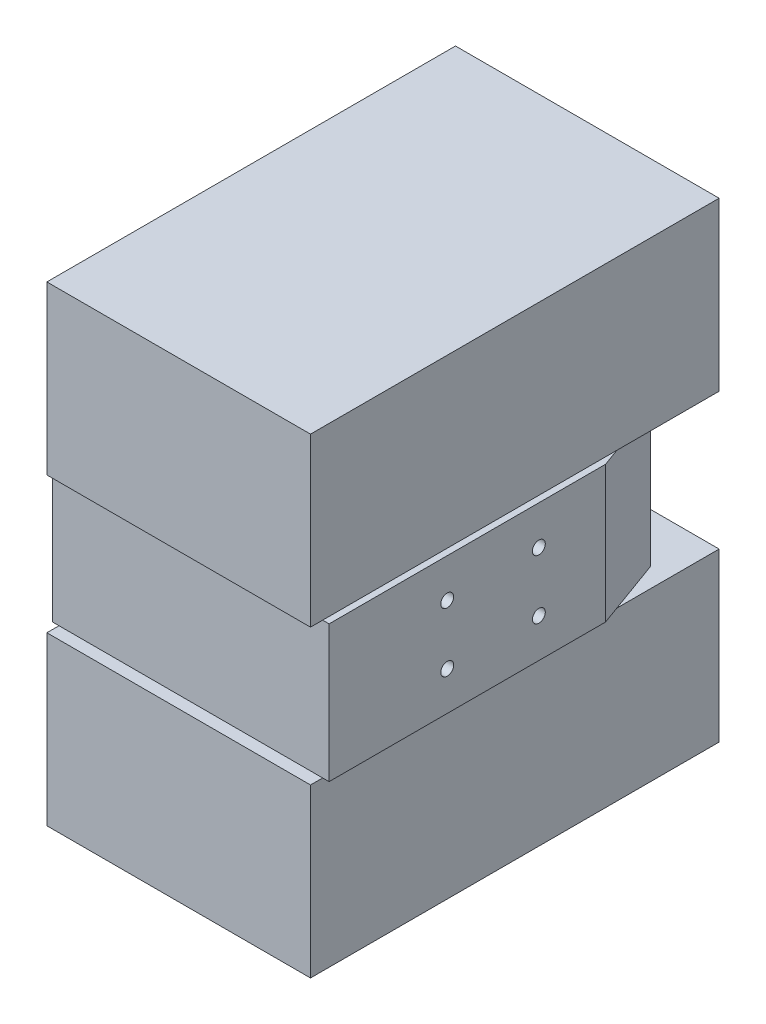
ISO-10303-21;
HEADER;
FILE_DESCRIPTION(('STEP AP214'),'2;1');
FILE_NAME('part.step','',(''),(''),'','','');
FILE_SCHEMA(('AUTOMOTIVE_DESIGN { 1 0 10303 214 1 1 1 1 }'));
ENDSEC;
DATA;
#1=APPLICATION_CONTEXT('core data for automotive mechanical design processes');
#2=APPLICATION_PROTOCOL_DEFINITION('international standard','automotive_design',2000,#1);
#3=PRODUCT_CONTEXT('',#1,'mechanical');
#4=PRODUCT('Part','Part','',(#3));
#5=PRODUCT_RELATED_PRODUCT_CATEGORY('part','',(#4));
#6=PRODUCT_DEFINITION_FORMATION('','',#4);
#7=PRODUCT_DEFINITION_CONTEXT('part definition',#1,'design');
#8=PRODUCT_DEFINITION('design','',#6,#7);
#9=PRODUCT_DEFINITION_SHAPE('','',#8);
#10=(LENGTH_UNIT() NAMED_UNIT(*) SI_UNIT(.MILLI.,.METRE.));
#11=(NAMED_UNIT(*) PLANE_ANGLE_UNIT() SI_UNIT($,.RADIAN.));
#12=(NAMED_UNIT(*) SI_UNIT($,.STERADIAN.) SOLID_ANGLE_UNIT());
#13=UNCERTAINTY_MEASURE_WITH_UNIT(LENGTH_MEASURE(1.E-05),#10,'distance_accuracy_value','');
#14=(GEOMETRIC_REPRESENTATION_CONTEXT(3) GLOBAL_UNCERTAINTY_ASSIGNED_CONTEXT((#13)) GLOBAL_UNIT_ASSIGNED_CONTEXT((#10,
#11,#12)) REPRESENTATION_CONTEXT('',''));
#15=CARTESIAN_POINT('',(0.,0.,0.));
#16=DIRECTION('',(0.,0.,1.));
#17=DIRECTION('',(1.,0.,0.));
#18=AXIS2_PLACEMENT_3D('',#15,#16,#17);
#19=CARTESIAN_POINT('',(0.,-21.25,0.));
#20=DIRECTION('',(0.,-1.,0.));
#21=DIRECTION('',(0.,0.,-1.));
#22=AXIS2_PLACEMENT_3D('',#19,#20,#21);
#23=PLANE('',#22);
#24=DIRECTION('',(-0.341743063086704,0.,0.939793423488437));
#25=VECTOR('',#24,1.);
#26=CARTESIAN_POINT('',(-43.,-21.25,22.));
#27=LINE('',#26,#25);
#28=CARTESIAN_POINT('',(-41.,-21.25,16.5));
#29=VERTEX_POINT('',#28);
#30=CARTESIAN_POINT('',(-43.,-21.25,22.));
#31=VERTEX_POINT('',#30);
#32=EDGE_CURVE('E350',#29,#31,#27,.T.);
#33=ORIENTED_EDGE('',*,*,#32,.F.);
#34=DIRECTION('',(0.,0.,1.));
#35=VECTOR('',#34,1.);
#36=CARTESIAN_POINT('',(-41.,-21.25,-15.32));
#37=LINE('',#36,#35);
#38=CARTESIAN_POINT('',(-41.,-21.25,108.));
#39=VERTEX_POINT('',#38);
#40=EDGE_CURVE('E11',#29,#39,#37,.T.);
#41=ORIENTED_EDGE('',*,*,#40,.T.);
#42=DIRECTION('',(1.,0.,0.));
#43=VECTOR('',#42,1.);
#44=CARTESIAN_POINT('',(-43.,-21.25,108.));
#45=LINE('',#44,#43);
#46=CARTESIAN_POINT('',(-43.,-21.25,108.));
#47=VERTEX_POINT('',#46);
#48=EDGE_CURVE('E332',#47,#39,#45,.T.);
#49=ORIENTED_EDGE('',*,*,#48,.F.);
#50=DIRECTION('',(0.,0.,1.));
#51=VECTOR('',#50,1.);
#52=CARTESIAN_POINT('',(-43.,-21.25,108.));
#53=LINE('',#52,#51);
#54=EDGE_CURVE('E327',#31,#47,#53,.T.);
#55=ORIENTED_EDGE('',*,*,#54,.F.);
#56=EDGE_LOOP('',(#33,#41,#49,#55));
#57=FACE_BOUND('',#56,.T.);
#58=ADVANCED_FACE('F39',(#57),#23,.T.);
#59=CARTESIAN_POINT('',(41.,-21.25,108.));
#60=VERTEX_POINT('',#59);
#61=CARTESIAN_POINT('',(43.,-21.25,108.));
#62=VERTEX_POINT('',#61);
#63=EDGE_CURVE('E331',#60,#62,#45,.T.);
#64=ORIENTED_EDGE('',*,*,#63,.F.);
#65=DIRECTION('',(0.,0.,-1.));
#66=VECTOR('',#65,1.);
#67=CARTESIAN_POINT('',(41.,-21.25,-15.32));
#68=LINE('',#67,#66);
#69=CARTESIAN_POINT('',(41.,-21.25,16.5));
#70=VERTEX_POINT('',#69);
#71=EDGE_CURVE('E49',#60,#70,#68,.T.);
#72=ORIENTED_EDGE('',*,*,#71,.T.);
#73=DIRECTION('',(-0.341743063086704,0.,-0.939793423488437));
#74=VECTOR('',#73,1.);
#75=CARTESIAN_POINT('',(35.,-21.25,0.));
#76=LINE('',#75,#74);
#77=CARTESIAN_POINT('',(43.,-21.25,22.));
#78=VERTEX_POINT('',#77);
#79=EDGE_CURVE('E342',#78,#70,#76,.T.);
#80=ORIENTED_EDGE('',*,*,#79,.F.);
#81=DIRECTION('',(0.,0.,-1.));
#82=VECTOR('',#81,1.);
#83=CARTESIAN_POINT('',(43.,-21.25,108.));
#84=LINE('',#83,#82);
#85=EDGE_CURVE('E336',#62,#78,#84,.T.);
#86=ORIENTED_EDGE('',*,*,#85,.F.);
#87=EDGE_LOOP('',(#64,#72,#80,#86));
#88=FACE_BOUND('',#87,.T.);
#89=ADVANCED_FACE('F453',(#88),#23,.T.);
#90=CARTESIAN_POINT('',(0.,21.25,0.));
#91=DIRECTION('',(0.,-1.,0.));
#92=DIRECTION('',(0.,0.,-1.));
#93=AXIS2_PLACEMENT_3D('',#90,#91,#92);
#94=PLANE('',#93);
#95=DIRECTION('',(0.,0.,1.));
#96=VECTOR('',#95,1.);
#97=CARTESIAN_POINT('',(-41.,21.25,-15.32));
#98=LINE('',#97,#96);
#99=CARTESIAN_POINT('',(-41.,21.25,16.5));
#100=VERTEX_POINT('',#99);
#101=CARTESIAN_POINT('',(-41.,21.25,108.));
#102=VERTEX_POINT('',#101);
#103=EDGE_CURVE('E67',#100,#102,#98,.T.);
#104=ORIENTED_EDGE('',*,*,#103,.F.);
#105=DIRECTION('',(-0.341743063086704,0.,0.939793423488437));
#106=VECTOR('',#105,1.);
#107=CARTESIAN_POINT('',(-43.,21.25,22.));
#108=LINE('',#107,#106);
#109=CARTESIAN_POINT('',(-43.,21.25,22.));
#110=VERTEX_POINT('',#109);
#111=EDGE_CURVE('E322',#100,#110,#108,.T.);
#112=ORIENTED_EDGE('',*,*,#111,.T.);
#113=DIRECTION('',(0.,0.,1.));
#114=VECTOR('',#113,1.);
#115=CARTESIAN_POINT('',(-43.,21.25,108.));
#116=LINE('',#115,#114);
#117=CARTESIAN_POINT('',(-43.,21.25,108.));
#118=VERTEX_POINT('',#117);
#119=EDGE_CURVE('E298',#110,#118,#116,.T.);
#120=ORIENTED_EDGE('',*,*,#119,.T.);
#121=DIRECTION('',(1.,0.,0.));
#122=VECTOR('',#121,1.);
#123=CARTESIAN_POINT('',(-43.,21.25,108.));
#124=LINE('',#123,#122);
#125=EDGE_CURVE('E306',#118,#102,#124,.T.);
#126=ORIENTED_EDGE('',*,*,#125,.T.);
#127=EDGE_LOOP('',(#104,#112,#120,#126));
#128=FACE_BOUND('',#127,.T.);
#129=ADVANCED_FACE('F384',(#128),#94,.F.);
#130=DIRECTION('',(0.,0.,-1.));
#131=VECTOR('',#130,1.);
#132=CARTESIAN_POINT('',(41.,21.25,-15.32));
#133=LINE('',#132,#131);
#134=CARTESIAN_POINT('',(41.,21.25,108.));
#135=VERTEX_POINT('',#134);
#136=CARTESIAN_POINT('',(41.,21.25,16.5));
#137=VERTEX_POINT('',#136);
#138=EDGE_CURVE('E251',#135,#137,#133,.T.);
#139=ORIENTED_EDGE('',*,*,#138,.F.);
#140=CARTESIAN_POINT('',(43.,21.25,108.));
#141=VERTEX_POINT('',#140);
#142=EDGE_CURVE('E305',#135,#141,#124,.T.);
#143=ORIENTED_EDGE('',*,*,#142,.T.);
#144=DIRECTION('',(0.,0.,-1.));
#145=VECTOR('',#144,1.);
#146=CARTESIAN_POINT('',(43.,21.25,108.));
#147=LINE('',#146,#145);
#148=CARTESIAN_POINT('',(43.,21.25,22.));
#149=VERTEX_POINT('',#148);
#150=EDGE_CURVE('E309',#141,#149,#147,.T.);
#151=ORIENTED_EDGE('',*,*,#150,.T.);
#152=DIRECTION('',(-0.341743063086704,0.,-0.939793423488437));
#153=VECTOR('',#152,1.);
#154=CARTESIAN_POINT('',(35.,21.25,0.));
#155=LINE('',#154,#153);
#156=EDGE_CURVE('E315',#149,#137,#155,.T.);
#157=ORIENTED_EDGE('',*,*,#156,.T.);
#158=EDGE_LOOP('',(#139,#143,#151,#157));
#159=FACE_BOUND('',#158,.T.);
#160=ADVANCED_FACE('F417',(#159),#94,.F.);
#161=CARTESIAN_POINT('',(-43.,-21.25,108.));
#162=DIRECTION('',(-1.,0.,0.));
#163=DIRECTION('',(0.,0.,1.));
#164=AXIS2_PLACEMENT_3D('',#161,#162,#163);
#165=PLANE('',#164);
#166=CARTESIAN_POINT('',(-43.,-9.2,71.25));
#167=DIRECTION('',(1.,0.,0.));
#168=DIRECTION('',(0.,0.,1.));
#169=AXIS2_PLACEMENT_3D('',#166,#167,#168);
#170=CIRCLE('',#169,2.);
#171=CARTESIAN_POINT('',(-43.,-9.2,73.25));
#172=VERTEX_POINT('',#171);
#173=EDGE_CURVE('E287',#172,#172,#170,.T.);
#174=ORIENTED_EDGE('',*,*,#173,.T.);
#175=EDGE_LOOP('',(#174));
#176=FACE_BOUND('',#175,.T.);
#177=CARTESIAN_POINT('',(-43.,-9.2,42.75));
#178=DIRECTION('',(1.,0.,0.));
#179=DIRECTION('',(0.,0.,1.));
#180=AXIS2_PLACEMENT_3D('',#177,#178,#179);
#181=CIRCLE('',#180,2.);
#182=CARTESIAN_POINT('',(-43.,-9.2,44.75));
#183=VERTEX_POINT('',#182);
#184=EDGE_CURVE('E279',#183,#183,#181,.T.);
#185=ORIENTED_EDGE('',*,*,#184,.T.);
#186=EDGE_LOOP('',(#185));
#187=FACE_BOUND('',#186,.T.);
#188=CARTESIAN_POINT('',(-43.,9.2,42.75));
#189=DIRECTION('',(1.,0.,0.));
#190=DIRECTION('',(0.,0.,-1.));
#191=AXIS2_PLACEMENT_3D('',#188,#189,#190);
#192=CIRCLE('',#191,2.);
#193=CARTESIAN_POINT('',(-43.,9.2,40.75));
#194=VERTEX_POINT('',#193);
#195=EDGE_CURVE('E270',#194,#194,#192,.T.);
#196=ORIENTED_EDGE('',*,*,#195,.T.);
#197=EDGE_LOOP('',(#196));
#198=FACE_BOUND('',#197,.T.);
#199=CARTESIAN_POINT('',(-43.,9.2,71.25));
#200=DIRECTION('',(1.,0.,0.));
#201=DIRECTION('',(0.,0.,-1.));
#202=AXIS2_PLACEMENT_3D('',#199,#200,#201);
#203=CIRCLE('',#202,2.);
#204=CARTESIAN_POINT('',(-43.,9.2,69.25));
#205=VERTEX_POINT('',#204);
#206=EDGE_CURVE('E294',#205,#205,#203,.T.);
#207=ORIENTED_EDGE('',*,*,#206,.T.);
#208=EDGE_LOOP('',(#207));
#209=FACE_BOUND('',#208,.T.);
#210=DIRECTION('',(0.,1.,0.));
#211=VECTOR('',#210,1.);
#212=CARTESIAN_POINT('',(-43.,-21.25,108.));
#213=LINE('',#212,#211);
#214=EDGE_CURVE('E43',#47,#118,#213,.T.);
#215=ORIENTED_EDGE('',*,*,#214,.T.);
#216=ORIENTED_EDGE('',*,*,#119,.F.);
#217=DIRECTION('',(0.,1.,0.));
#218=VECTOR('',#217,1.);
#219=CARTESIAN_POINT('',(-43.,-21.25,22.));
#220=LINE('',#219,#218);
#221=EDGE_CURVE('E355',#31,#110,#220,.T.);
#222=ORIENTED_EDGE('',*,*,#221,.F.);
#223=ORIENTED_EDGE('',*,*,#54,.T.);
#224=EDGE_LOOP('',(#215,#216,#222,#223));
#225=FACE_BOUND('',#224,.T.);
#226=ADVANCED_FACE('F41',(#176,#187,#198,#209,#225),#165,.T.);
#227=CARTESIAN_POINT('',(-43.,-21.25,22.));
#228=DIRECTION('',(-0.939793423488437,0.,-0.341743063086704));
#229=DIRECTION('',(-0.341743063086704,0.,0.939793423488437));
#230=AXIS2_PLACEMENT_3D('',#227,#228,#229);
#231=PLANE('',#230);
#232=ORIENTED_EDGE('',*,*,#221,.T.);
#233=ORIENTED_EDGE('',*,*,#111,.F.);
#234=CARTESIAN_POINT('',(-35.,21.25,0.));
#235=VERTEX_POINT('',#234);
#236=EDGE_CURVE('E323',#235,#100,#108,.T.);
#237=ORIENTED_EDGE('',*,*,#236,.F.);
#238=DIRECTION('',(0.,1.,0.));
#239=VECTOR('',#238,1.);
#240=CARTESIAN_POINT('',(-35.,-21.25,0.));
#241=LINE('',#240,#239);
#242=CARTESIAN_POINT('',(-35.,-21.25,0.));
#243=VERTEX_POINT('',#242);
#244=EDGE_CURVE('E359',#243,#235,#241,.T.);
#245=ORIENTED_EDGE('',*,*,#244,.F.);
#246=EDGE_CURVE('E351',#243,#29,#27,.T.);
#247=ORIENTED_EDGE('',*,*,#246,.T.);
#248=ORIENTED_EDGE('',*,*,#32,.T.);
#249=EDGE_LOOP('',(#232,#233,#237,#245,#247,#248));
#250=FACE_BOUND('',#249,.T.);
#251=ADVANCED_FACE('F388',(#250),#231,.T.);
#252=CARTESIAN_POINT('',(-35.,-21.25,0.));
#253=DIRECTION('',(0.,0.,-1.));
#254=DIRECTION('',(-1.,0.,0.));
#255=AXIS2_PLACEMENT_3D('',#252,#253,#254);
#256=PLANE('',#255);
#257=ORIENTED_EDGE('',*,*,#244,.T.);
#258=DIRECTION('',(-1.,0.,0.));
#259=VECTOR('',#258,1.);
#260=CARTESIAN_POINT('',(-35.,21.25,0.));
#261=LINE('',#260,#259);
#262=CARTESIAN_POINT('',(35.,21.25,0.));
#263=VERTEX_POINT('',#262);
#264=EDGE_CURVE('E318',#263,#235,#261,.T.);
#265=ORIENTED_EDGE('',*,*,#264,.F.);
#266=DIRECTION('',(0.,1.,0.));
#267=VECTOR('',#266,1.);
#268=CARTESIAN_POINT('',(35.,-21.25,0.));
#269=LINE('',#268,#267);
#270=CARTESIAN_POINT('',(35.,-21.25,0.));
#271=VERTEX_POINT('',#270);
#272=EDGE_CURVE('E362',#271,#263,#269,.T.);
#273=ORIENTED_EDGE('',*,*,#272,.F.);
#274=DIRECTION('',(-1.,0.,0.));
#275=VECTOR('',#274,1.);
#276=CARTESIAN_POINT('',(-35.,-21.25,0.));
#277=LINE('',#276,#275);
#278=EDGE_CURVE('E346',#271,#243,#277,.T.);
#279=ORIENTED_EDGE('',*,*,#278,.T.);
#280=EDGE_LOOP('',(#257,#265,#273,#279));
#281=FACE_BOUND('',#280,.T.);
#282=ADVANCED_FACE('F442',(#281),#256,.T.);
#283=CARTESIAN_POINT('',(35.,-21.25,0.));
#284=DIRECTION('',(0.939793423488437,0.,-0.341743063086704));
#285=DIRECTION('',(-0.341743063086704,0.,-0.939793423488437));
#286=AXIS2_PLACEMENT_3D('',#283,#284,#285);
#287=PLANE('',#286);
#288=ORIENTED_EDGE('',*,*,#272,.T.);
#289=EDGE_CURVE('E314',#137,#263,#155,.T.);
#290=ORIENTED_EDGE('',*,*,#289,.F.);
#291=ORIENTED_EDGE('',*,*,#156,.F.);
#292=DIRECTION('',(0.,1.,0.));
#293=VECTOR('',#292,1.);
#294=CARTESIAN_POINT('',(43.,-21.25,22.));
#295=LINE('',#294,#293);
#296=EDGE_CURVE('E365',#78,#149,#295,.T.);
#297=ORIENTED_EDGE('',*,*,#296,.F.);
#298=ORIENTED_EDGE('',*,*,#79,.T.);
#299=EDGE_CURVE('E341',#70,#271,#76,.T.);
#300=ORIENTED_EDGE('',*,*,#299,.T.);
#301=EDGE_LOOP('',(#288,#290,#291,#297,#298,#300));
#302=FACE_BOUND('',#301,.T.);
#303=ADVANCED_FACE('F447',(#302),#287,.T.);
#304=CARTESIAN_POINT('',(43.,-21.25,108.));
#305=DIRECTION('',(1.,0.,0.));
#306=DIRECTION('',(0.,0.,-1.));
#307=AXIS2_PLACEMENT_3D('',#304,#305,#306);
#308=PLANE('',#307);
#309=CARTESIAN_POINT('',(43.,-9.2,71.25));
#310=DIRECTION('',(1.,0.,0.));
#311=DIRECTION('',(0.,0.,1.));
#312=AXIS2_PLACEMENT_3D('',#309,#310,#311);
#313=CIRCLE('',#312,2.);
#314=CARTESIAN_POINT('',(43.,-9.2,73.25));
#315=VERTEX_POINT('',#314);
#316=EDGE_CURVE('E269',#315,#315,#313,.T.);
#317=ORIENTED_EDGE('',*,*,#316,.F.);
#318=EDGE_LOOP('',(#317));
#319=FACE_BOUND('',#318,.T.);
#320=CARTESIAN_POINT('',(43.,-9.2,42.75));
#321=DIRECTION('',(1.,0.,0.));
#322=DIRECTION('',(0.,0.,1.));
#323=AXIS2_PLACEMENT_3D('',#320,#321,#322);
#324=CIRCLE('',#323,2.);
#325=CARTESIAN_POINT('',(43.,-9.2,44.75));
#326=VERTEX_POINT('',#325);
#327=EDGE_CURVE('E283',#326,#326,#324,.T.);
#328=ORIENTED_EDGE('',*,*,#327,.F.);
#329=EDGE_LOOP('',(#328));
#330=FACE_BOUND('',#329,.T.);
#331=CARTESIAN_POINT('',(43.,9.2,42.75));
#332=DIRECTION('',(1.,0.,0.));
#333=DIRECTION('',(0.,0.,-1.));
#334=AXIS2_PLACEMENT_3D('',#331,#332,#333);
#335=CIRCLE('',#334,2.);
#336=CARTESIAN_POINT('',(43.,9.2,40.75));
#337=VERTEX_POINT('',#336);
#338=EDGE_CURVE('E275',#337,#337,#335,.T.);
#339=ORIENTED_EDGE('',*,*,#338,.F.);
#340=EDGE_LOOP('',(#339));
#341=FACE_BOUND('',#340,.T.);
#342=CARTESIAN_POINT('',(43.,9.2,71.25));
#343=DIRECTION('',(1.,0.,0.));
#344=DIRECTION('',(0.,0.,-1.));
#345=AXIS2_PLACEMENT_3D('',#342,#343,#344);
#346=CIRCLE('',#345,2.);
#347=CARTESIAN_POINT('',(43.,9.2,69.25));
#348=VERTEX_POINT('',#347);
#349=EDGE_CURVE('E274',#348,#348,#346,.T.);
#350=ORIENTED_EDGE('',*,*,#349,.F.);
#351=EDGE_LOOP('',(#350));
#352=FACE_BOUND('',#351,.T.);
#353=ORIENTED_EDGE('',*,*,#296,.T.);
#354=ORIENTED_EDGE('',*,*,#150,.F.);
#355=DIRECTION('',(0.,1.,0.));
#356=VECTOR('',#355,1.);
#357=CARTESIAN_POINT('',(43.,-21.25,108.));
#358=LINE('',#357,#356);
#359=EDGE_CURVE('E367',#62,#141,#358,.T.);
#360=ORIENTED_EDGE('',*,*,#359,.F.);
#361=ORIENTED_EDGE('',*,*,#85,.T.);
#362=EDGE_LOOP('',(#353,#354,#360,#361));
#363=FACE_BOUND('',#362,.T.);
#364=ADVANCED_FACE('F455',(#319,#330,#341,#352,#363),#308,.T.);
#365=CARTESIAN_POINT('',(-43.,-21.25,108.));
#366=DIRECTION('',(0.,0.,1.));
#367=DIRECTION('',(1.,0.,0.));
#368=AXIS2_PLACEMENT_3D('',#365,#366,#367);
#369=PLANE('',#368);
#370=ORIENTED_EDGE('',*,*,#359,.T.);
#371=ORIENTED_EDGE('',*,*,#142,.F.);
#372=EDGE_CURVE('E310',#102,#135,#124,.T.);
#373=ORIENTED_EDGE('',*,*,#372,.F.);
#374=ORIENTED_EDGE('',*,*,#125,.F.);
#375=ORIENTED_EDGE('',*,*,#214,.F.);
#376=ORIENTED_EDGE('',*,*,#48,.T.);
#377=EDGE_CURVE('E337',#39,#60,#45,.T.);
#378=ORIENTED_EDGE('',*,*,#377,.T.);
#379=ORIENTED_EDGE('',*,*,#63,.T.);
#380=EDGE_LOOP('',(#370,#371,#373,#374,#375,#376,#378,#379));
#381=FACE_BOUND('',#380,.T.);
#382=ADVANCED_FACE('F381',(#381),#369,.T.);
#383=CARTESIAN_POINT('',(-43.,9.2,71.25));
#384=DIRECTION('',(1.,0.,0.));
#385=DIRECTION('',(0.,0.,-1.));
#386=AXIS2_PLACEMENT_3D('',#383,#384,#385);
#387=CYLINDRICAL_SURFACE('',#386,2.);
#388=ORIENTED_EDGE('',*,*,#206,.F.);
#389=EDGE_LOOP('',(#388));
#390=FACE_BOUND('',#389,.T.);
#391=ORIENTED_EDGE('',*,*,#349,.T.);
#392=EDGE_LOOP('',(#391));
#393=FACE_BOUND('',#392,.T.);
#394=ADVANCED_FACE('F464',(#390,#393),#387,.F.);
#395=CARTESIAN_POINT('',(-43.,9.2,42.75));
#396=DIRECTION('',(1.,0.,0.));
#397=DIRECTION('',(0.,0.,-1.));
#398=AXIS2_PLACEMENT_3D('',#395,#396,#397);
#399=CYLINDRICAL_SURFACE('',#398,2.);
#400=ORIENTED_EDGE('',*,*,#195,.F.);
#401=EDGE_LOOP('',(#400));
#402=FACE_BOUND('',#401,.T.);
#403=ORIENTED_EDGE('',*,*,#338,.T.);
#404=EDGE_LOOP('',(#403));
#405=FACE_BOUND('',#404,.T.);
#406=ADVANCED_FACE('F566',(#402,#405),#399,.F.);
#407=CARTESIAN_POINT('',(-43.,-9.2,42.75));
#408=DIRECTION('',(1.,0.,0.));
#409=DIRECTION('',(0.,0.,-1.));
#410=AXIS2_PLACEMENT_3D('',#407,#408,#409);
#411=CYLINDRICAL_SURFACE('',#410,2.);
#412=ORIENTED_EDGE('',*,*,#184,.F.);
#413=EDGE_LOOP('',(#412));
#414=FACE_BOUND('',#413,.T.);
#415=ORIENTED_EDGE('',*,*,#327,.T.);
#416=EDGE_LOOP('',(#415));
#417=FACE_BOUND('',#416,.T.);
#418=ADVANCED_FACE('F569',(#414,#417),#411,.F.);
#419=CARTESIAN_POINT('',(-43.,-9.2,71.25));
#420=DIRECTION('',(1.,0.,0.));
#421=DIRECTION('',(0.,0.,-1.));
#422=AXIS2_PLACEMENT_3D('',#419,#420,#421);
#423=CYLINDRICAL_SURFACE('',#422,2.);
#424=ORIENTED_EDGE('',*,*,#173,.F.);
#425=EDGE_LOOP('',(#424));
#426=FACE_BOUND('',#425,.T.);
#427=ORIENTED_EDGE('',*,*,#316,.T.);
#428=EDGE_LOOP('',(#427));
#429=FACE_BOUND('',#428,.T.);
#430=ADVANCED_FACE('F573',(#426,#429),#423,.F.);
#431=CARTESIAN_POINT('',(0.,21.25,0.));
#432=DIRECTION('',(0.,-1.,0.));
#433=DIRECTION('',(0.,0.,-1.));
#434=AXIS2_PLACEMENT_3D('',#431,#432,#433);
#435=PLANE('',#434);
#436=CARTESIAN_POINT('',(-41.,21.25,111.774201991714));
#437=VERTEX_POINT('',#436);
#438=EDGE_CURVE('E182',#102,#437,#98,.T.);
#439=ORIENTED_EDGE('',*,*,#438,.F.);
#440=ORIENTED_EDGE('',*,*,#372,.T.);
#441=CARTESIAN_POINT('',(41.,21.25,111.774201991714));
#442=VERTEX_POINT('',#441);
#443=EDGE_CURVE('E247',#442,#135,#133,.T.);
#444=ORIENTED_EDGE('',*,*,#443,.F.);
#445=DIRECTION('',(1.,0.,0.));
#446=VECTOR('',#445,1.);
#447=CARTESIAN_POINT('',(41.,21.25,111.774201991714));
#448=LINE('',#447,#446);
#449=EDGE_CURVE('E243',#437,#442,#448,.T.);
#450=ORIENTED_EDGE('',*,*,#449,.F.);
#451=EDGE_LOOP('',(#439,#440,#444,#450));
#452=FACE_BOUND('',#451,.T.);
#453=ADVANCED_FACE('F421',(#452),#435,.T.);
#454=CARTESIAN_POINT('',(-41.,73.25,-15.32));
#455=DIRECTION('',(1.,0.,0.));
#456=DIRECTION('',(0.,0.,-1.));
#457=AXIS2_PLACEMENT_3D('',#454,#455,#456);
#458=PLANE('',#457);
#459=CARTESIAN_POINT('',(-41.,21.25,-15.32));
#460=VERTEX_POINT('',#459);
#461=EDGE_CURVE('E239',#460,#100,#98,.T.);
#462=ORIENTED_EDGE('',*,*,#461,.T.);
#463=ORIENTED_EDGE('',*,*,#103,.T.);
#464=ORIENTED_EDGE('',*,*,#438,.T.);
#465=DIRECTION('',(0.,-1.,0.));
#466=VECTOR('',#465,1.);
#467=CARTESIAN_POINT('',(-41.,73.25,111.774201991714));
#468=LINE('',#467,#466);
#469=CARTESIAN_POINT('',(-41.,73.25,111.774201991714));
#470=VERTEX_POINT('',#469);
#471=EDGE_CURVE('E265',#470,#437,#468,.T.);
#472=ORIENTED_EDGE('',*,*,#471,.F.);
#473=DIRECTION('',(0.,0.,1.));
#474=VECTOR('',#473,1.);
#475=CARTESIAN_POINT('',(-41.,73.25,-15.32));
#476=LINE('',#475,#474);
#477=CARTESIAN_POINT('',(-41.,73.25,-15.32));
#478=VERTEX_POINT('',#477);
#479=EDGE_CURVE('E224',#478,#470,#476,.T.);
#480=ORIENTED_EDGE('',*,*,#479,.F.);
#481=DIRECTION('',(0.,-1.,0.));
#482=VECTOR('',#481,1.);
#483=CARTESIAN_POINT('',(-41.,73.25,-15.32));
#484=LINE('',#483,#482);
#485=EDGE_CURVE('E238',#478,#460,#484,.T.);
#486=ORIENTED_EDGE('',*,*,#485,.T.);
#487=EDGE_LOOP('',(#462,#463,#464,#472,#480,#486));
#488=FACE_BOUND('',#487,.T.);
#489=ADVANCED_FACE('F426',(#488),#458,.F.);
#490=CARTESIAN_POINT('',(41.,73.25,111.774201991714));
#491=DIRECTION('',(0.,0.,-1.));
#492=DIRECTION('',(-1.,0.,0.));
#493=AXIS2_PLACEMENT_3D('',#490,#491,#492);
#494=PLANE('',#493);
#495=ORIENTED_EDGE('',*,*,#449,.T.);
#496=DIRECTION('',(0.,-1.,0.));
#497=VECTOR('',#496,1.);
#498=CARTESIAN_POINT('',(41.,73.25,111.774201991714));
#499=LINE('',#498,#497);
#500=CARTESIAN_POINT('',(41.,73.25,111.774201991714));
#501=VERTEX_POINT('',#500);
#502=EDGE_CURVE('E261',#501,#442,#499,.T.);
#503=ORIENTED_EDGE('',*,*,#502,.F.);
#504=DIRECTION('',(1.,0.,0.));
#505=VECTOR('',#504,1.);
#506=CARTESIAN_POINT('',(41.,73.25,111.774201991714));
#507=LINE('',#506,#505);
#508=EDGE_CURVE('E228',#470,#501,#507,.T.);
#509=ORIENTED_EDGE('',*,*,#508,.F.);
#510=ORIENTED_EDGE('',*,*,#471,.T.);
#511=EDGE_LOOP('',(#495,#503,#509,#510));
#512=FACE_BOUND('',#511,.T.);
#513=ADVANCED_FACE('F424',(#512),#494,.F.);
#514=CARTESIAN_POINT('',(41.,73.25,-15.32));
#515=DIRECTION('',(-1.,0.,0.));
#516=DIRECTION('',(0.,0.,1.));
#517=AXIS2_PLACEMENT_3D('',#514,#515,#516);
#518=PLANE('',#517);
#519=ORIENTED_EDGE('',*,*,#443,.T.);
#520=ORIENTED_EDGE('',*,*,#138,.T.);
#521=CARTESIAN_POINT('',(41.,21.25,-15.32));
#522=VERTEX_POINT('',#521);
#523=EDGE_CURVE('E246',#137,#522,#133,.T.);
#524=ORIENTED_EDGE('',*,*,#523,.T.);
#525=DIRECTION('',(0.,-1.,0.));
#526=VECTOR('',#525,1.);
#527=CARTESIAN_POINT('',(41.,73.25,-15.32));
#528=LINE('',#527,#526);
#529=CARTESIAN_POINT('',(41.,73.25,-15.32));
#530=VERTEX_POINT('',#529);
#531=EDGE_CURVE('E257',#530,#522,#528,.T.);
#532=ORIENTED_EDGE('',*,*,#531,.F.);
#533=DIRECTION('',(0.,0.,-1.));
#534=VECTOR('',#533,1.);
#535=CARTESIAN_POINT('',(41.,73.25,-15.32));
#536=LINE('',#535,#534);
#537=EDGE_CURVE('E232',#501,#530,#536,.T.);
#538=ORIENTED_EDGE('',*,*,#537,.F.);
#539=ORIENTED_EDGE('',*,*,#502,.T.);
#540=EDGE_LOOP('',(#519,#520,#524,#532,#538,#539));
#541=FACE_BOUND('',#540,.T.);
#542=ADVANCED_FACE('F412',(#541),#518,.F.);
#543=CARTESIAN_POINT('',(41.,73.25,-15.32));
#544=DIRECTION('',(0.,0.,1.));
#545=DIRECTION('',(1.,0.,0.));
#546=AXIS2_PLACEMENT_3D('',#543,#544,#545);
#547=PLANE('',#546);
#548=DIRECTION('',(-1.,0.,0.));
#549=VECTOR('',#548,1.);
#550=CARTESIAN_POINT('',(41.,21.25,-15.32));
#551=LINE('',#550,#549);
#552=EDGE_CURVE('E229',#522,#460,#551,.T.);
#553=ORIENTED_EDGE('',*,*,#552,.T.);
#554=ORIENTED_EDGE('',*,*,#485,.F.);
#555=DIRECTION('',(-1.,0.,0.));
#556=VECTOR('',#555,1.);
#557=CARTESIAN_POINT('',(41.,73.25,-15.32));
#558=LINE('',#557,#556);
#559=EDGE_CURVE('E235',#530,#478,#558,.T.);
#560=ORIENTED_EDGE('',*,*,#559,.F.);
#561=ORIENTED_EDGE('',*,*,#531,.T.);
#562=EDGE_LOOP('',(#553,#554,#560,#561));
#563=FACE_BOUND('',#562,.T.);
#564=ADVANCED_FACE('F434',(#563),#547,.F.);
#565=CARTESIAN_POINT('',(0.,73.25,0.));
#566=DIRECTION('',(0.,-1.,0.));
#567=DIRECTION('',(0.,0.,-1.));
#568=AXIS2_PLACEMENT_3D('',#565,#566,#567);
#569=PLANE('',#568);
#570=ORIENTED_EDGE('',*,*,#479,.T.);
#571=ORIENTED_EDGE('',*,*,#508,.T.);
#572=ORIENTED_EDGE('',*,*,#537,.T.);
#573=ORIENTED_EDGE('',*,*,#559,.T.);
#574=EDGE_LOOP('',(#570,#571,#572,#573));
#575=FACE_BOUND('',#574,.T.);
#576=ADVANCED_FACE('F430',(#575),#569,.F.);
#577=ORIENTED_EDGE('',*,*,#523,.F.);
#578=ORIENTED_EDGE('',*,*,#289,.T.);
#579=ORIENTED_EDGE('',*,*,#264,.T.);
#580=ORIENTED_EDGE('',*,*,#236,.T.);
#581=ORIENTED_EDGE('',*,*,#461,.F.);
#582=ORIENTED_EDGE('',*,*,#552,.F.);
#583=EDGE_LOOP('',(#577,#578,#579,#580,#581,#582));
#584=FACE_BOUND('',#583,.T.);
#585=ADVANCED_FACE('F437',(#584),#435,.T.);
#586=CARTESIAN_POINT('',(0.,-21.25,0.));
#587=DIRECTION('',(0.,1.,0.));
#588=DIRECTION('',(0.,0.,-1.));
#589=AXIS2_PLACEMENT_3D('',#586,#587,#588);
#590=PLANE('',#589);
#591=ORIENTED_EDGE('',*,*,#246,.F.);
#592=ORIENTED_EDGE('',*,*,#278,.F.);
#593=ORIENTED_EDGE('',*,*,#299,.F.);
#594=CARTESIAN_POINT('',(41.,-21.25,-15.32));
#595=VERTEX_POINT('',#594);
#596=EDGE_CURVE('E59',#70,#595,#68,.T.);
#597=ORIENTED_EDGE('',*,*,#596,.T.);
#598=DIRECTION('',(-1.,0.,0.));
#599=VECTOR('',#598,1.);
#600=CARTESIAN_POINT('',(41.,-21.25,-15.32));
#601=LINE('',#600,#599);
#602=CARTESIAN_POINT('',(-41.,-21.25,-15.32));
#603=VERTEX_POINT('',#602);
#604=EDGE_CURVE('E207',#595,#603,#601,.T.);
#605=ORIENTED_EDGE('',*,*,#604,.T.);
#606=EDGE_CURVE('E51',#603,#29,#37,.T.);
#607=ORIENTED_EDGE('',*,*,#606,.T.);
#608=EDGE_LOOP('',(#591,#592,#593,#597,#605,#607));
#609=FACE_BOUND('',#608,.T.);
#610=ADVANCED_FACE('F445',(#609),#590,.T.);
#611=ORIENTED_EDGE('',*,*,#377,.F.);
#612=CARTESIAN_POINT('',(-41.,-21.25,111.774201991714));
#613=VERTEX_POINT('',#612);
#614=EDGE_CURVE('E52',#39,#613,#37,.T.);
#615=ORIENTED_EDGE('',*,*,#614,.T.);
#616=DIRECTION('',(1.,0.,0.));
#617=VECTOR('',#616,1.);
#618=CARTESIAN_POINT('',(41.,-21.25,111.774201991714));
#619=LINE('',#618,#617);
#620=CARTESIAN_POINT('',(41.,-21.25,111.774201991714));
#621=VERTEX_POINT('',#620);
#622=EDGE_CURVE('E194',#613,#621,#619,.T.);
#623=ORIENTED_EDGE('',*,*,#622,.T.);
#624=EDGE_CURVE('E210',#621,#60,#68,.T.);
#625=ORIENTED_EDGE('',*,*,#624,.T.);
#626=EDGE_LOOP('',(#611,#615,#623,#625));
#627=FACE_BOUND('',#626,.T.);
#628=ADVANCED_FACE('F499',(#627),#590,.T.);
#629=CARTESIAN_POINT('',(-41.,-73.25,-15.32));
#630=DIRECTION('',(-1.,0.,0.));
#631=DIRECTION('',(0.,0.,1.));
#632=AXIS2_PLACEMENT_3D('',#629,#630,#631);
#633=PLANE('',#632);
#634=ORIENTED_EDGE('',*,*,#606,.F.);
#635=DIRECTION('',(0.,1.,0.));
#636=VECTOR('',#635,1.);
#637=CARTESIAN_POINT('',(-41.,-73.25,-15.32));
#638=LINE('',#637,#636);
#639=CARTESIAN_POINT('',(-41.,-73.25,-15.32));
#640=VERTEX_POINT('',#639);
#641=EDGE_CURVE('E170',#640,#603,#638,.T.);
#642=ORIENTED_EDGE('',*,*,#641,.F.);
#643=DIRECTION('',(0.,0.,1.));
#644=VECTOR('',#643,1.);
#645=CARTESIAN_POINT('',(-41.,-73.25,-15.32));
#646=LINE('',#645,#644);
#647=CARTESIAN_POINT('',(-41.,-73.25,111.774201991714));
#648=VERTEX_POINT('',#647);
#649=EDGE_CURVE('E174',#640,#648,#646,.T.);
#650=ORIENTED_EDGE('',*,*,#649,.T.);
#651=DIRECTION('',(0.,1.,0.));
#652=VECTOR('',#651,1.);
#653=CARTESIAN_POINT('',(-41.,-73.25,111.774201991714));
#654=LINE('',#653,#652);
#655=EDGE_CURVE('E204',#648,#613,#654,.T.);
#656=ORIENTED_EDGE('',*,*,#655,.T.);
#657=ORIENTED_EDGE('',*,*,#614,.F.);
#658=ORIENTED_EDGE('',*,*,#40,.F.);
#659=EDGE_LOOP('',(#634,#642,#650,#656,#657,#658));
#660=FACE_BOUND('',#659,.T.);
#661=ADVANCED_FACE('F172',(#660),#633,.T.);
#662=CARTESIAN_POINT('',(41.,-73.25,-15.32));
#663=DIRECTION('',(0.,0.,-1.));
#664=DIRECTION('',(-1.,0.,0.));
#665=AXIS2_PLACEMENT_3D('',#662,#663,#664);
#666=PLANE('',#665);
#667=ORIENTED_EDGE('',*,*,#604,.F.);
#668=DIRECTION('',(0.,1.,0.));
#669=VECTOR('',#668,1.);
#670=CARTESIAN_POINT('',(41.,-73.25,-15.32));
#671=LINE('',#670,#669);
#672=CARTESIAN_POINT('',(41.,-73.25,-15.32));
#673=VERTEX_POINT('',#672);
#674=EDGE_CURVE('E183',#673,#595,#671,.T.);
#675=ORIENTED_EDGE('',*,*,#674,.F.);
#676=DIRECTION('',(-1.,0.,0.));
#677=VECTOR('',#676,1.);
#678=CARTESIAN_POINT('',(41.,-73.25,-15.32));
#679=LINE('',#678,#677);
#680=EDGE_CURVE('E189',#673,#640,#679,.T.);
#681=ORIENTED_EDGE('',*,*,#680,.T.);
#682=ORIENTED_EDGE('',*,*,#641,.T.);
#683=EDGE_LOOP('',(#667,#675,#681,#682));
#684=FACE_BOUND('',#683,.T.);
#685=ADVANCED_FACE('F196',(#684),#666,.T.);
#686=CARTESIAN_POINT('',(41.,-73.25,-15.32));
#687=DIRECTION('',(1.,0.,0.));
#688=DIRECTION('',(0.,0.,-1.));
#689=AXIS2_PLACEMENT_3D('',#686,#687,#688);
#690=PLANE('',#689);
#691=ORIENTED_EDGE('',*,*,#624,.F.);
#692=DIRECTION('',(0.,1.,0.));
#693=VECTOR('',#692,1.);
#694=CARTESIAN_POINT('',(41.,-73.25,111.774201991714));
#695=LINE('',#694,#693);
#696=CARTESIAN_POINT('',(41.,-73.25,111.774201991714));
#697=VERTEX_POINT('',#696);
#698=EDGE_CURVE('E219',#697,#621,#695,.T.);
#699=ORIENTED_EDGE('',*,*,#698,.F.);
#700=DIRECTION('',(0.,0.,-1.));
#701=VECTOR('',#700,1.);
#702=CARTESIAN_POINT('',(41.,-73.25,-15.32));
#703=LINE('',#702,#701);
#704=EDGE_CURVE('E198',#697,#673,#703,.T.);
#705=ORIENTED_EDGE('',*,*,#704,.T.);
#706=ORIENTED_EDGE('',*,*,#674,.T.);
#707=ORIENTED_EDGE('',*,*,#596,.F.);
#708=ORIENTED_EDGE('',*,*,#71,.F.);
#709=EDGE_LOOP('',(#691,#699,#705,#706,#707,#708));
#710=FACE_BOUND('',#709,.T.);
#711=ADVANCED_FACE('F524',(#710),#690,.T.);
#712=CARTESIAN_POINT('',(41.,-73.25,111.774201991714));
#713=DIRECTION('',(0.,0.,1.));
#714=DIRECTION('',(1.,0.,0.));
#715=AXIS2_PLACEMENT_3D('',#712,#713,#714);
#716=PLANE('',#715);
#717=ORIENTED_EDGE('',*,*,#622,.F.);
#718=ORIENTED_EDGE('',*,*,#655,.F.);
#719=DIRECTION('',(1.,0.,0.));
#720=VECTOR('',#719,1.);
#721=CARTESIAN_POINT('',(41.,-73.25,111.774201991714));
#722=LINE('',#721,#720);
#723=EDGE_CURVE('E192',#648,#697,#722,.T.);
#724=ORIENTED_EDGE('',*,*,#723,.T.);
#725=ORIENTED_EDGE('',*,*,#698,.T.);
#726=EDGE_LOOP('',(#717,#718,#724,#725));
#727=FACE_BOUND('',#726,.T.);
#728=ADVANCED_FACE('F533',(#727),#716,.T.);
#729=CARTESIAN_POINT('',(0.,-73.25,0.));
#730=DIRECTION('',(0.,1.,0.));
#731=DIRECTION('',(0.,0.,-1.));
#732=AXIS2_PLACEMENT_3D('',#729,#730,#731);
#733=PLANE('',#732);
#734=ORIENTED_EDGE('',*,*,#649,.F.);
#735=ORIENTED_EDGE('',*,*,#680,.F.);
#736=ORIENTED_EDGE('',*,*,#704,.F.);
#737=ORIENTED_EDGE('',*,*,#723,.F.);
#738=EDGE_LOOP('',(#734,#735,#736,#737));
#739=FACE_BOUND('',#738,.T.);
#740=ADVANCED_FACE('F187',(#739),#733,.F.);
#741=CLOSED_SHELL('',(#58,#89,#129,#160,#226,#251,#282,#303,#364,#382,#394,#406,#418,#430,#453,
#489,#513,#542,#564,#576,#585,#610,#628,#661,#685,#711,#728,#740));
#742=MANIFOLD_SOLID_BREP('B2',#741);
#743=ADVANCED_BREP_SHAPE_REPRESENTATION('',(#18,#742),#14);
#744=SHAPE_DEFINITION_REPRESENTATION(#9,#743);
ENDSEC;
END-ISO-10303-21;
